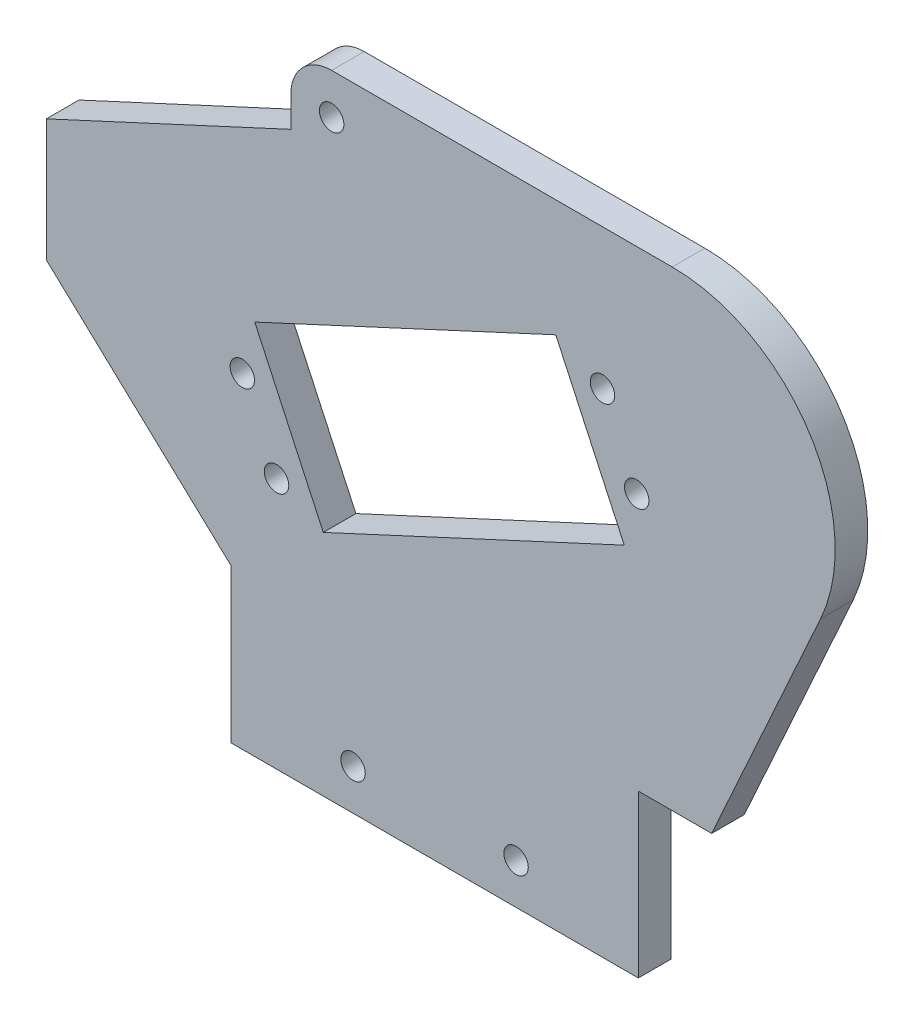
ISO-10303-21;
HEADER;
FILE_DESCRIPTION(('STEP AP214'),'2;1');
FILE_NAME('part.step','',(''),(''),'','','');
FILE_SCHEMA(('AUTOMOTIVE_DESIGN { 1 0 10303 214 1 1 1 1 }'));
ENDSEC;
DATA;
#1=APPLICATION_CONTEXT('core data for automotive mechanical design processes');
#2=APPLICATION_PROTOCOL_DEFINITION('international standard','automotive_design',2000,#1);
#3=PRODUCT_CONTEXT('',#1,'mechanical');
#4=PRODUCT('Part','Part','',(#3));
#5=PRODUCT_RELATED_PRODUCT_CATEGORY('part','',(#4));
#6=PRODUCT_DEFINITION_FORMATION('','',#4);
#7=PRODUCT_DEFINITION_CONTEXT('part definition',#1,'design');
#8=PRODUCT_DEFINITION('design','',#6,#7);
#9=PRODUCT_DEFINITION_SHAPE('','',#8);
#10=(LENGTH_UNIT() NAMED_UNIT(*) SI_UNIT(.MILLI.,.METRE.));
#11=(NAMED_UNIT(*) PLANE_ANGLE_UNIT() SI_UNIT($,.RADIAN.));
#12=(NAMED_UNIT(*) SI_UNIT($,.STERADIAN.) SOLID_ANGLE_UNIT());
#13=UNCERTAINTY_MEASURE_WITH_UNIT(LENGTH_MEASURE(1.E-05),#10,'distance_accuracy_value','');
#14=(GEOMETRIC_REPRESENTATION_CONTEXT(3) GLOBAL_UNCERTAINTY_ASSIGNED_CONTEXT((#13)) GLOBAL_UNIT_ASSIGNED_CONTEXT((#10,
#11,#12)) REPRESENTATION_CONTEXT('',''));
#15=CARTESIAN_POINT('',(0.,0.,0.));
#16=DIRECTION('',(0.,0.,1.));
#17=DIRECTION('',(1.,0.,0.));
#18=AXIS2_PLACEMENT_3D('',#15,#16,#17);
#19=CARTESIAN_POINT('',(0.,-50.,4.));
#20=DIRECTION('',(0.,-1.,0.));
#21=DIRECTION('',(1.,0.,0.));
#22=AXIS2_PLACEMENT_3D('',#19,#20,#21);
#23=PLANE('',#22);
#24=DIRECTION('',(-1.,0.,0.));
#25=VECTOR('',#24,1.);
#26=CARTESIAN_POINT('',(0.,-50.,0.));
#27=LINE('',#26,#25);
#28=CARTESIAN_POINT('',(15.,-50.,0.));
#29=VERTEX_POINT('',#28);
#30=CARTESIAN_POINT('',(-35.,-50.,0.));
#31=VERTEX_POINT('',#30);
#32=EDGE_CURVE('E171',#29,#31,#27,.T.);
#33=ORIENTED_EDGE('',*,*,#32,.F.);
#34=DIRECTION('',(0.,0.,-1.));
#35=VECTOR('',#34,1.);
#36=CARTESIAN_POINT('',(15.,-50.,4.));
#37=LINE('',#36,#35);
#38=CARTESIAN_POINT('',(15.,-50.,4.));
#39=VERTEX_POINT('',#38);
#40=EDGE_CURVE('E11',#39,#29,#37,.T.);
#41=ORIENTED_EDGE('',*,*,#40,.F.);
#42=DIRECTION('',(-1.,0.,0.));
#43=VECTOR('',#42,1.);
#44=CARTESIAN_POINT('',(0.,-50.,4.));
#45=LINE('',#44,#43);
#46=CARTESIAN_POINT('',(-35.,-50.,4.));
#47=VERTEX_POINT('',#46);
#48=EDGE_CURVE('E208',#39,#47,#45,.T.);
#49=ORIENTED_EDGE('',*,*,#48,.T.);
#50=DIRECTION('',(0.,0.,-1.));
#51=VECTOR('',#50,1.);
#52=CARTESIAN_POINT('',(-35.,-50.,4.));
#53=LINE('',#52,#51);
#54=EDGE_CURVE('E209',#47,#31,#53,.T.);
#55=ORIENTED_EDGE('',*,*,#54,.T.);
#56=EDGE_LOOP('',(#33,#41,#49,#55));
#57=FACE_BOUND('',#56,.T.);
#58=ADVANCED_FACE('F36',(#57),#23,.T.);
#59=CARTESIAN_POINT('',(31.2418684292143,-14.1568600723833,4.));
#60=DIRECTION('',(-0.910848988545081,0.412739772818665,0.));
#61=DIRECTION('',(-0.412739772818665,-0.910848988545081,0.));
#62=AXIS2_PLACEMENT_3D('',#59,#60,#61);
#63=PLANE('',#62);
#64=DIRECTION('',(0.412739772818665,0.910848988545081,0.));
#65=VECTOR('',#64,1.);
#66=CARTESIAN_POINT('',(31.2418684292143,-14.1568600723833,4.));
#67=LINE('',#66,#65);
#68=CARTESIAN_POINT('',(24.,-30.1384760162008,4.));
#69=VERTEX_POINT('',#68);
#70=CARTESIAN_POINT('',(37.3725830020305,-0.627378458403735,4.));
#71=VERTEX_POINT('',#70);
#72=EDGE_CURVE('E162',#69,#71,#67,.T.);
#73=ORIENTED_EDGE('',*,*,#72,.F.);
#74=DIRECTION('',(0.,0.,-1.));
#75=VECTOR('',#74,1.);
#76=CARTESIAN_POINT('',(24.,-30.1384760162008,10.));
#77=LINE('',#76,#75);
#78=CARTESIAN_POINT('',(24.,-30.1384760162008,0.));
#79=VERTEX_POINT('',#78);
#80=EDGE_CURVE('E150',#69,#79,#77,.T.);
#81=ORIENTED_EDGE('',*,*,#80,.T.);
#82=DIRECTION('',(0.412739772818665,0.910848988545081,0.));
#83=VECTOR('',#82,1.);
#84=CARTESIAN_POINT('',(31.2418684292143,-14.1568600723833,0.));
#85=LINE('',#84,#83);
#86=CARTESIAN_POINT('',(37.3725830020305,-0.627378458403735,0.));
#87=VERTEX_POINT('',#86);
#88=EDGE_CURVE('E160',#79,#87,#85,.T.);
#89=ORIENTED_EDGE('',*,*,#88,.T.);
#90=DIRECTION('',(0.,0.,-1.));
#91=VECTOR('',#90,1.);
#92=CARTESIAN_POINT('',(37.3725830020305,-0.627378458403735,4.));
#93=LINE('',#92,#91);
#94=EDGE_CURVE('E43',#71,#87,#93,.T.);
#95=ORIENTED_EDGE('',*,*,#94,.F.);
#96=EDGE_LOOP('',(#73,#81,#89,#95));
#97=FACE_BOUND('',#96,.T.);
#98=ADVANCED_FACE('F158',(#97),#63,.F.);
#99=CARTESIAN_POINT('',(19.1556032311289,7.62741699796956,4.));
#100=DIRECTION('',(0.,0.,-1.));
#101=DIRECTION('',(-1.,0.,0.));
#102=AXIS2_PLACEMENT_3D('',#99,#100,#101);
#103=CYLINDRICAL_SURFACE('',#102,20.);
#104=CARTESIAN_POINT('',(19.1556032311289,7.62741699796956,0.));
#105=DIRECTION('',(0.,0.,1.));
#106=DIRECTION('',(1.,0.,0.));
#107=AXIS2_PLACEMENT_3D('',#104,#105,#106);
#108=CIRCLE('',#107,20.);
#109=CARTESIAN_POINT('',(19.1556032311289,27.6274169979696,0.));
#110=VERTEX_POINT('',#109);
#111=EDGE_CURVE('E170',#110,#87,#108,.F.);
#112=ORIENTED_EDGE('',*,*,#111,.F.);
#113=DIRECTION('',(0.,0.,-1.));
#114=VECTOR('',#113,1.);
#115=CARTESIAN_POINT('',(19.1556032311289,27.6274169979696,4.));
#116=LINE('',#115,#114);
#117=CARTESIAN_POINT('',(19.1556032311289,27.6274169979696,4.));
#118=VERTEX_POINT('',#117);
#119=EDGE_CURVE('E224',#118,#110,#116,.T.);
#120=ORIENTED_EDGE('',*,*,#119,.F.);
#121=CARTESIAN_POINT('',(19.1556032311289,7.62741699796956,4.));
#122=DIRECTION('',(0.,0.,1.));
#123=DIRECTION('',(1.,0.,0.));
#124=AXIS2_PLACEMENT_3D('',#121,#122,#123);
#125=CIRCLE('',#124,20.);
#126=EDGE_CURVE('E229',#118,#71,#125,.F.);
#127=ORIENTED_EDGE('',*,*,#126,.T.);
#128=ORIENTED_EDGE('',*,*,#94,.T.);
#129=EDGE_LOOP('',(#112,#120,#127,#128));
#130=FACE_BOUND('',#129,.T.);
#131=ADVANCED_FACE('F227',(#130),#103,.T.);
#132=CARTESIAN_POINT('',(0.,27.6274169979696,4.));
#133=DIRECTION('',(0.,1.,0.));
#134=DIRECTION('',(-1.,0.,0.));
#135=AXIS2_PLACEMENT_3D('',#132,#133,#134);
#136=PLANE('',#135);
#137=DIRECTION('',(1.,0.,0.));
#138=VECTOR('',#137,1.);
#139=CARTESIAN_POINT('',(0.,27.6274169979696,0.));
#140=LINE('',#139,#138);
#141=CARTESIAN_POINT('',(-22.6274169979695,27.6274169979696,0.));
#142=VERTEX_POINT('',#141);
#143=EDGE_CURVE('E173',#142,#110,#140,.T.);
#144=ORIENTED_EDGE('',*,*,#143,.F.);
#145=DIRECTION('',(0.,0.,-1.));
#146=VECTOR('',#145,1.);
#147=CARTESIAN_POINT('',(-22.6274169979695,27.6274169979696,4.));
#148=LINE('',#147,#146);
#149=CARTESIAN_POINT('',(-22.6274169979695,27.6274169979696,4.));
#150=VERTEX_POINT('',#149);
#151=EDGE_CURVE('E222',#150,#142,#148,.T.);
#152=ORIENTED_EDGE('',*,*,#151,.F.);
#153=DIRECTION('',(1.,0.,0.));
#154=VECTOR('',#153,1.);
#155=CARTESIAN_POINT('',(0.,27.6274169979696,4.));
#156=LINE('',#155,#154);
#157=EDGE_CURVE('E233',#150,#118,#156,.T.);
#158=ORIENTED_EDGE('',*,*,#157,.T.);
#159=ORIENTED_EDGE('',*,*,#119,.T.);
#160=EDGE_LOOP('',(#144,#152,#158,#159));
#161=FACE_BOUND('',#160,.T.);
#162=ADVANCED_FACE('F317',(#161),#136,.T.);
#163=CARTESIAN_POINT('',(-22.6274169979695,22.6274169979696,4.));
#164=DIRECTION('',(0.,0.,-1.));
#165=DIRECTION('',(-1.,0.,0.));
#166=AXIS2_PLACEMENT_3D('',#163,#164,#165);
#167=CYLINDRICAL_SURFACE('',#166,5.);
#168=CARTESIAN_POINT('',(-22.6274169979695,22.6274169979696,0.));
#169=DIRECTION('',(0.,0.,1.));
#170=DIRECTION('',(1.,0.,0.));
#171=AXIS2_PLACEMENT_3D('',#168,#169,#170);
#172=CIRCLE('',#171,5.);
#173=CARTESIAN_POINT('',(-27.6274169979695,22.6274169979696,0.));
#174=VERTEX_POINT('',#173);
#175=EDGE_CURVE('E181',#174,#142,#172,.F.);
#176=ORIENTED_EDGE('',*,*,#175,.F.);
#177=DIRECTION('',(0.,0.,-1.));
#178=VECTOR('',#177,1.);
#179=CARTESIAN_POINT('',(-27.6274169979695,22.6274169979696,4.));
#180=LINE('',#179,#178);
#181=CARTESIAN_POINT('',(-27.6274169979695,22.6274169979696,4.));
#182=VERTEX_POINT('',#181);
#183=EDGE_CURVE('E220',#182,#174,#180,.T.);
#184=ORIENTED_EDGE('',*,*,#183,.F.);
#185=CARTESIAN_POINT('',(-22.6274169979695,22.6274169979696,4.));
#186=DIRECTION('',(0.,0.,1.));
#187=DIRECTION('',(1.,0.,0.));
#188=AXIS2_PLACEMENT_3D('',#185,#186,#187);
#189=CIRCLE('',#188,5.);
#190=EDGE_CURVE('E235',#182,#150,#189,.F.);
#191=ORIENTED_EDGE('',*,*,#190,.T.);
#192=ORIENTED_EDGE('',*,*,#151,.T.);
#193=EDGE_LOOP('',(#176,#184,#191,#192));
#194=FACE_BOUND('',#193,.T.);
#195=ADVANCED_FACE('F314',(#194),#167,.T.);
#196=CARTESIAN_POINT('',(-27.6274169979695,0.,4.));
#197=DIRECTION('',(-1.,0.,0.));
#198=DIRECTION('',(0.,0.,1.));
#199=AXIS2_PLACEMENT_3D('',#196,#197,#198);
#200=PLANE('',#199);
#201=DIRECTION('',(0.,1.,0.));
#202=VECTOR('',#201,1.);
#203=CARTESIAN_POINT('',(-27.6274169979695,0.,0.));
#204=LINE('',#203,#202);
#205=CARTESIAN_POINT('',(-27.6274169979695,18.8599043076142,0.));
#206=VERTEX_POINT('',#205);
#207=EDGE_CURVE('E184',#206,#174,#204,.T.);
#208=ORIENTED_EDGE('',*,*,#207,.F.);
#209=DIRECTION('',(0.,0.,-1.));
#210=VECTOR('',#209,1.);
#211=CARTESIAN_POINT('',(-27.6274169979695,18.8599043076142,4.));
#212=LINE('',#211,#210);
#213=CARTESIAN_POINT('',(-27.6274169979695,18.8599043076142,4.));
#214=VERTEX_POINT('',#213);
#215=EDGE_CURVE('E218',#214,#206,#212,.T.);
#216=ORIENTED_EDGE('',*,*,#215,.F.);
#217=DIRECTION('',(0.,1.,0.));
#218=VECTOR('',#217,1.);
#219=CARTESIAN_POINT('',(-27.6274169979695,0.,4.));
#220=LINE('',#219,#218);
#221=EDGE_CURVE('E242',#214,#182,#220,.T.);
#222=ORIENTED_EDGE('',*,*,#221,.T.);
#223=ORIENTED_EDGE('',*,*,#183,.T.);
#224=EDGE_LOOP('',(#208,#216,#222,#223));
#225=FACE_BOUND('',#224,.T.);
#226=ADVANCED_FACE('F310',(#225),#200,.T.);
#227=CARTESIAN_POINT('',(-12.0602624641426,26.0632911788168,4.));
#228=DIRECTION('',(-0.419949330471577,0.907547552383055,0.));
#229=DIRECTION('',(-0.907547552383055,-0.419949330471577,0.));
#230=AXIS2_PLACEMENT_3D('',#227,#228,#229);
#231=PLANE('',#230);
#232=DIRECTION('',(0.907547552383055,0.419949330471577,0.));
#233=VECTOR('',#232,1.);
#234=CARTESIAN_POINT('',(-12.0602624641426,26.0632911788168,0.));
#235=LINE('',#234,#233);
#236=CARTESIAN_POINT('',(-57.6274169979695,4.97800921455162,0.));
#237=VERTEX_POINT('',#236);
#238=EDGE_CURVE('E187',#237,#206,#235,.T.);
#239=ORIENTED_EDGE('',*,*,#238,.F.);
#240=DIRECTION('',(0.,0.,-1.));
#241=VECTOR('',#240,1.);
#242=CARTESIAN_POINT('',(-57.6274169979695,4.97800921455162,4.));
#243=LINE('',#242,#241);
#244=CARTESIAN_POINT('',(-57.6274169979695,4.97800921455162,4.));
#245=VERTEX_POINT('',#244);
#246=EDGE_CURVE('E216',#245,#237,#243,.T.);
#247=ORIENTED_EDGE('',*,*,#246,.F.);
#248=DIRECTION('',(0.907547552383055,0.419949330471577,0.));
#249=VECTOR('',#248,1.);
#250=CARTESIAN_POINT('',(-12.0602624641426,26.0632911788168,4.));
#251=LINE('',#250,#249);
#252=EDGE_CURVE('E245',#245,#214,#251,.T.);
#253=ORIENTED_EDGE('',*,*,#252,.T.);
#254=ORIENTED_EDGE('',*,*,#215,.T.);
#255=EDGE_LOOP('',(#239,#247,#253,#254));
#256=FACE_BOUND('',#255,.T.);
#257=ADVANCED_FACE('F306',(#256),#231,.T.);
#258=CARTESIAN_POINT('',(-57.6274169979695,0.,4.));
#259=DIRECTION('',(-1.,0.,0.));
#260=DIRECTION('',(0.,0.,1.));
#261=AXIS2_PLACEMENT_3D('',#258,#259,#260);
#262=PLANE('',#261);
#263=DIRECTION('',(0.,1.,0.));
#264=VECTOR('',#263,1.);
#265=CARTESIAN_POINT('',(-57.6274169979695,0.,0.));
#266=LINE('',#265,#264);
#267=CARTESIAN_POINT('',(-57.6274169979695,-10.0219907854484,0.));
#268=VERTEX_POINT('',#267);
#269=EDGE_CURVE('E190',#268,#237,#266,.T.);
#270=ORIENTED_EDGE('',*,*,#269,.F.);
#271=DIRECTION('',(0.,0.,-1.));
#272=VECTOR('',#271,1.);
#273=CARTESIAN_POINT('',(-57.6274169979695,-10.0219907854484,4.));
#274=LINE('',#273,#272);
#275=CARTESIAN_POINT('',(-57.6274169979695,-10.0219907854484,4.));
#276=VERTEX_POINT('',#275);
#277=EDGE_CURVE('E214',#276,#268,#274,.T.);
#278=ORIENTED_EDGE('',*,*,#277,.F.);
#279=DIRECTION('',(0.,1.,0.));
#280=VECTOR('',#279,1.);
#281=CARTESIAN_POINT('',(-57.6274169979695,0.,4.));
#282=LINE('',#281,#280);
#283=EDGE_CURVE('E248',#276,#245,#282,.T.);
#284=ORIENTED_EDGE('',*,*,#283,.T.);
#285=ORIENTED_EDGE('',*,*,#246,.T.);
#286=EDGE_LOOP('',(#270,#278,#284,#285));
#287=FACE_BOUND('',#286,.T.);
#288=ADVANCED_FACE('F302',(#287),#262,.T.);
#289=CARTESIAN_POINT('',(-31.826885426635,-34.1015546361118,4.));
#290=DIRECTION('',(-0.682304132096237,-0.73106844503398,0.));
#291=DIRECTION('',(0.73106844503398,-0.682304132096237,0.));
#292=AXIS2_PLACEMENT_3D('',#289,#290,#291);
#293=PLANE('',#292);
#294=DIRECTION('',(-0.73106844503398,0.682304132096237,0.));
#295=VECTOR('',#294,1.);
#296=CARTESIAN_POINT('',(-31.826885426635,-34.1015546361118,0.));
#297=LINE('',#296,#295);
#298=CARTESIAN_POINT('',(-35.,-31.1400956923858,0.));
#299=VERTEX_POINT('',#298);
#300=EDGE_CURVE('E193',#299,#268,#297,.T.);
#301=ORIENTED_EDGE('',*,*,#300,.F.);
#302=DIRECTION('',(0.,0.,-1.));
#303=VECTOR('',#302,1.);
#304=CARTESIAN_POINT('',(-35.,-31.1400956923858,4.));
#305=LINE('',#304,#303);
#306=CARTESIAN_POINT('',(-35.,-31.1400956923858,4.));
#307=VERTEX_POINT('',#306);
#308=EDGE_CURVE('E211',#307,#299,#305,.T.);
#309=ORIENTED_EDGE('',*,*,#308,.F.);
#310=DIRECTION('',(-0.73106844503398,0.682304132096237,0.));
#311=VECTOR('',#310,1.);
#312=CARTESIAN_POINT('',(-31.826885426635,-34.1015546361118,4.));
#313=LINE('',#312,#311);
#314=EDGE_CURVE('E251',#307,#276,#313,.T.);
#315=ORIENTED_EDGE('',*,*,#314,.T.);
#316=ORIENTED_EDGE('',*,*,#277,.T.);
#317=EDGE_LOOP('',(#301,#309,#315,#316));
#318=FACE_BOUND('',#317,.T.);
#319=ADVANCED_FACE('F298',(#318),#293,.T.);
#320=CARTESIAN_POINT('',(-22.6274169979695,22.6274169979696,4.));
#321=DIRECTION('',(0.,0.,-1.));
#322=DIRECTION('',(-1.,0.,0.));
#323=AXIS2_PLACEMENT_3D('',#320,#321,#322);
#324=CYLINDRICAL_SURFACE('',#323,1.5);
#325=CARTESIAN_POINT('',(-22.6274169979695,22.6274169979696,4.));
#326=DIRECTION('',(0.,0.,1.));
#327=DIRECTION('',(1.,0.,0.));
#328=AXIS2_PLACEMENT_3D('',#325,#326,#327);
#329=CIRCLE('',#328,1.5);
#330=CARTESIAN_POINT('',(-21.1274169979695,22.6274169979696,4.));
#331=VERTEX_POINT('',#330);
#332=EDGE_CURVE('E260',#331,#331,#329,.T.);
#333=ORIENTED_EDGE('',*,*,#332,.T.);
#334=EDGE_LOOP('',(#333));
#335=FACE_BOUND('',#334,.T.);
#336=CARTESIAN_POINT('',(-22.6274169979695,22.6274169979696,0.));
#337=DIRECTION('',(0.,0.,1.));
#338=DIRECTION('',(1.,0.,0.));
#339=AXIS2_PLACEMENT_3D('',#336,#337,#338);
#340=CIRCLE('',#339,1.5);
#341=CARTESIAN_POINT('',(-21.1274169979695,22.6274169979696,0.));
#342=VERTEX_POINT('',#341);
#343=EDGE_CURVE('E202',#342,#342,#340,.T.);
#344=ORIENTED_EDGE('',*,*,#343,.F.);
#345=EDGE_LOOP('',(#344));
#346=FACE_BOUND('',#345,.T.);
#347=ADVANCED_FACE('F498',(#335,#346),#324,.F.);
#348=CARTESIAN_POINT('',(0.,-45.,4.));
#349=DIRECTION('',(0.,0.,-1.));
#350=DIRECTION('',(-1.,0.,0.));
#351=AXIS2_PLACEMENT_3D('',#348,#349,#350);
#352=CYLINDRICAL_SURFACE('',#351,1.5);
#353=CARTESIAN_POINT('',(0.,-45.,4.));
#354=DIRECTION('',(0.,0.,1.));
#355=DIRECTION('',(1.,0.,0.));
#356=AXIS2_PLACEMENT_3D('',#353,#354,#355);
#357=CIRCLE('',#356,1.5);
#358=CARTESIAN_POINT('',(1.50000000000001,-45.,4.));
#359=VERTEX_POINT('',#358);
#360=EDGE_CURVE('E257',#359,#359,#357,.T.);
#361=ORIENTED_EDGE('',*,*,#360,.T.);
#362=EDGE_LOOP('',(#361));
#363=FACE_BOUND('',#362,.T.);
#364=CARTESIAN_POINT('',(0.,-45.,0.));
#365=DIRECTION('',(0.,0.,1.));
#366=DIRECTION('',(1.,0.,0.));
#367=AXIS2_PLACEMENT_3D('',#364,#365,#366);
#368=CIRCLE('',#367,1.5);
#369=CARTESIAN_POINT('',(1.50000000000001,-45.,0.));
#370=VERTEX_POINT('',#369);
#371=EDGE_CURVE('E199',#370,#370,#368,.T.);
#372=ORIENTED_EDGE('',*,*,#371,.F.);
#373=EDGE_LOOP('',(#372));
#374=FACE_BOUND('',#373,.T.);
#375=ADVANCED_FACE('F490',(#363,#374),#352,.F.);
#376=CARTESIAN_POINT('',(-35.,0.,4.));
#377=DIRECTION('',(-1.,0.,0.));
#378=DIRECTION('',(0.,0.,1.));
#379=AXIS2_PLACEMENT_3D('',#376,#377,#378);
#380=PLANE('',#379);
#381=DIRECTION('',(0.,1.,0.));
#382=VECTOR('',#381,1.);
#383=CARTESIAN_POINT('',(-35.,0.,0.));
#384=LINE('',#383,#382);
#385=EDGE_CURVE('E196',#31,#299,#384,.T.);
#386=ORIENTED_EDGE('',*,*,#385,.F.);
#387=ORIENTED_EDGE('',*,*,#54,.F.);
#388=DIRECTION('',(0.,1.,0.));
#389=VECTOR('',#388,1.);
#390=CARTESIAN_POINT('',(-35.,0.,4.));
#391=LINE('',#390,#389);
#392=EDGE_CURVE('E254',#47,#307,#391,.T.);
#393=ORIENTED_EDGE('',*,*,#392,.T.);
#394=ORIENTED_EDGE('',*,*,#308,.T.);
#395=EDGE_LOOP('',(#386,#387,#393,#394));
#396=FACE_BOUND('',#395,.T.);
#397=ADVANCED_FACE('F278',(#396),#380,.T.);
#398=CARTESIAN_POINT('',(-20.,-45.,4.));
#399=DIRECTION('',(0.,0.,-1.));
#400=DIRECTION('',(-1.,0.,0.));
#401=AXIS2_PLACEMENT_3D('',#398,#399,#400);
#402=CYLINDRICAL_SURFACE('',#401,1.5);
#403=CARTESIAN_POINT('',(-20.,-45.,4.));
#404=DIRECTION('',(0.,0.,1.));
#405=DIRECTION('',(1.,0.,0.));
#406=AXIS2_PLACEMENT_3D('',#403,#404,#405);
#407=CIRCLE('',#406,1.5);
#408=CARTESIAN_POINT('',(-18.5,-45.,4.));
#409=VERTEX_POINT('',#408);
#410=EDGE_CURVE('E212',#409,#409,#407,.T.);
#411=ORIENTED_EDGE('',*,*,#410,.T.);
#412=EDGE_LOOP('',(#411));
#413=FACE_BOUND('',#412,.T.);
#414=CARTESIAN_POINT('',(-20.,-45.,0.));
#415=DIRECTION('',(0.,0.,1.));
#416=DIRECTION('',(1.,0.,0.));
#417=AXIS2_PLACEMENT_3D('',#414,#415,#416);
#418=CIRCLE('',#417,1.5);
#419=CARTESIAN_POINT('',(-18.5,-45.,0.));
#420=VERTEX_POINT('',#419);
#421=EDGE_CURVE('E205',#420,#420,#418,.T.);
#422=ORIENTED_EDGE('',*,*,#421,.F.);
#423=EDGE_LOOP('',(#422));
#424=FACE_BOUND('',#423,.T.);
#425=ADVANCED_FACE('F265',(#413,#424),#402,.F.);
#426=CARTESIAN_POINT('',(0.,0.,4.));
#427=DIRECTION('',(0.,0.,1.));
#428=DIRECTION('',(1.,0.,0.));
#429=AXIS2_PLACEMENT_3D('',#426,#427,#428);
#430=PLANE('',#429);
#431=DIRECTION('',(0.,-1.,0.));
#432=VECTOR('',#431,1.);
#433=CARTESIAN_POINT('',(15.,0.,4.));
#434=LINE('',#433,#432);
#435=CARTESIAN_POINT('',(15.,-30.1384760162008,4.));
#436=VERTEX_POINT('',#435);
#437=EDGE_CURVE('E318',#436,#39,#434,.T.);
#438=ORIENTED_EDGE('',*,*,#437,.F.);
#439=DIRECTION('',(-1.,0.,0.));
#440=VECTOR('',#439,1.);
#441=CARTESIAN_POINT('',(0.,-30.1384760162008,4.));
#442=LINE('',#441,#440);
#443=EDGE_CURVE('E163',#69,#436,#442,.T.);
#444=ORIENTED_EDGE('',*,*,#443,.F.);
#445=ORIENTED_EDGE('',*,*,#72,.T.);
#446=ORIENTED_EDGE('',*,*,#126,.F.);
#447=ORIENTED_EDGE('',*,*,#157,.F.);
#448=ORIENTED_EDGE('',*,*,#190,.F.);
#449=ORIENTED_EDGE('',*,*,#221,.F.);
#450=ORIENTED_EDGE('',*,*,#252,.F.);
#451=ORIENTED_EDGE('',*,*,#283,.F.);
#452=ORIENTED_EDGE('',*,*,#314,.F.);
#453=ORIENTED_EDGE('',*,*,#392,.F.);
#454=ORIENTED_EDGE('',*,*,#48,.F.);
#455=EDGE_LOOP('',(#438,#444,#445,#446,#447,#448,#449,#450,#451,#452,#453,#454));
#456=FACE_BOUND('',#455,.T.);
#457=CARTESIAN_POINT('',(10.6013869918596,10.4216406505323,4.));
#458=DIRECTION('',(0.,0.,1.));
#459=DIRECTION('',(1.,0.,0.));
#460=AXIS2_PLACEMENT_3D('',#457,#458,#459);
#461=CIRCLE('',#460,1.5);
#462=CARTESIAN_POINT('',(12.1013869918596,10.4216406505323,4.));
#463=VERTEX_POINT('',#462);
#464=EDGE_CURVE('E364',#463,#463,#461,.T.);
#465=ORIENTED_EDGE('',*,*,#464,.F.);
#466=EDGE_LOOP('',(#465));
#467=FACE_BOUND('',#466,.T.);
#468=CARTESIAN_POINT('',(14.804827451052,1.34799263520661,4.));
#469=DIRECTION('',(0.,0.,1.));
#470=DIRECTION('',(1.,0.,0.));
#471=AXIS2_PLACEMENT_3D('',#468,#469,#470);
#472=CIRCLE('',#471,1.5);
#473=CARTESIAN_POINT('',(16.304827451052,1.34799263520661,4.));
#474=VERTEX_POINT('',#473);
#475=EDGE_CURVE('E358',#474,#474,#472,.T.);
#476=ORIENTED_EDGE('',*,*,#475,.F.);
#477=EDGE_LOOP('',(#476));
#478=FACE_BOUND('',#477,.T.);
#479=CARTESIAN_POINT('',(-29.3838383835841,-19.1227624010607,4.));
#480=DIRECTION('',(0.,0.,1.));
#481=DIRECTION('',(1.,0.,0.));
#482=AXIS2_PLACEMENT_3D('',#479,#480,#481);
#483=CIRCLE('',#482,1.5);
#484=CARTESIAN_POINT('',(-27.8838383835841,-19.1227624010607,4.));
#485=VERTEX_POINT('',#484);
#486=EDGE_CURVE('E352',#485,#485,#483,.T.);
#487=ORIENTED_EDGE('',*,*,#486,.F.);
#488=EDGE_LOOP('',(#487));
#489=FACE_BOUND('',#488,.T.);
#490=CARTESIAN_POINT('',(-33.5872788427765,-10.049114385735,4.));
#491=DIRECTION('',(0.,0.,1.));
#492=DIRECTION('',(1.,0.,0.));
#493=AXIS2_PLACEMENT_3D('',#490,#491,#492);
#494=CIRCLE('',#493,1.5);
#495=CARTESIAN_POINT('',(-32.0872788427765,-10.049114385735,4.));
#496=VERTEX_POINT('',#495);
#497=EDGE_CURVE('E349',#496,#496,#494,.T.);
#498=ORIENTED_EDGE('',*,*,#497,.F.);
#499=EDGE_LOOP('',(#498));
#500=FACE_BOUND('',#499,.T.);
#501=DIRECTION('',(0.907364801532571,0.420344045919243,0.));
#502=VECTOR('',#501,1.);
#503=CARTESIAN_POINT('',(4.20344045919242,-9.07364801532569,4.));
#504=LINE('',#503,#502);
#505=CARTESIAN_POINT('',(-23.6526589478576,-21.9782102250465,4.));
#506=VERTEX_POINT('',#505);
#507=CARTESIAN_POINT('',(13.277088474518,-4.87020755613331,4.));
#508=VERTEX_POINT('',#507);
#509=EDGE_CURVE('E57',#506,#508,#504,.T.);
#510=ORIENTED_EDGE('',*,*,#509,.F.);
#511=DIRECTION('',(-0.420344045919246,0.907364801532569,0.));
#512=VECTOR('',#511,1.);
#513=CARTESIAN_POINT('',(-27.85609940705,-12.9045622097209,4.));
#514=LINE('',#513,#512);
#515=CARTESIAN_POINT('',(-32.0595398662425,-3.83091419439522,4.));
#516=VERTEX_POINT('',#515);
#517=EDGE_CURVE('E328',#506,#516,#514,.T.);
#518=ORIENTED_EDGE('',*,*,#517,.T.);
#519=DIRECTION('',(0.907364801532569,0.420344045919246,0.));
#520=VECTOR('',#519,1.);
#521=CARTESIAN_POINT('',(-4.20344045919245,9.07364801532569,4.));
#522=LINE('',#521,#520);
#523=CARTESIAN_POINT('',(4.87020755613311,13.2770884745181,4.));
#524=VERTEX_POINT('',#523);
#525=EDGE_CURVE('E332',#516,#524,#522,.T.);
#526=ORIENTED_EDGE('',*,*,#525,.T.);
#527=DIRECTION('',(-0.420344045919246,0.907364801532569,0.));
#528=VECTOR('',#527,1.);
#529=CARTESIAN_POINT('',(9.07364801532556,4.20344045919239,4.));
#530=LINE('',#529,#528);
#531=EDGE_CURVE('E335',#508,#524,#530,.T.);
#532=ORIENTED_EDGE('',*,*,#531,.F.);
#533=EDGE_LOOP('',(#510,#518,#526,#532));
#534=FACE_BOUND('',#533,.T.);
#535=ORIENTED_EDGE('',*,*,#360,.F.);
#536=EDGE_LOOP('',(#535));
#537=FACE_BOUND('',#536,.T.);
#538=ORIENTED_EDGE('',*,*,#332,.F.);
#539=EDGE_LOOP('',(#538));
#540=FACE_BOUND('',#539,.T.);
#541=ORIENTED_EDGE('',*,*,#410,.F.);
#542=EDGE_LOOP('',(#541));
#543=FACE_BOUND('',#542,.T.);
#544=ADVANCED_FACE('F268',(#456,#467,#478,#489,#500,#534,#537,#540,#543),#430,.T.);
#545=CARTESIAN_POINT('',(0.,0.,0.));
#546=DIRECTION('',(0.,0.,1.));
#547=DIRECTION('',(1.,0.,0.));
#548=AXIS2_PLACEMENT_3D('',#545,#546,#547);
#549=PLANE('',#548);
#550=CARTESIAN_POINT('',(10.6013869918596,10.4216406505323,0.));
#551=DIRECTION('',(0.,0.,1.));
#552=DIRECTION('',(1.,0.,0.));
#553=AXIS2_PLACEMENT_3D('',#550,#551,#552);
#554=CIRCLE('',#553,1.5);
#555=CARTESIAN_POINT('',(12.1013869918596,10.4216406505323,0.));
#556=VERTEX_POINT('',#555);
#557=EDGE_CURVE('E367',#556,#556,#554,.T.);
#558=ORIENTED_EDGE('',*,*,#557,.T.);
#559=EDGE_LOOP('',(#558));
#560=FACE_BOUND('',#559,.T.);
#561=CARTESIAN_POINT('',(14.804827451052,1.34799263520661,0.));
#562=DIRECTION('',(0.,0.,1.));
#563=DIRECTION('',(1.,0.,0.));
#564=AXIS2_PLACEMENT_3D('',#561,#562,#563);
#565=CIRCLE('',#564,1.5);
#566=CARTESIAN_POINT('',(16.304827451052,1.34799263520661,0.));
#567=VERTEX_POINT('',#566);
#568=EDGE_CURVE('E361',#567,#567,#565,.T.);
#569=ORIENTED_EDGE('',*,*,#568,.T.);
#570=EDGE_LOOP('',(#569));
#571=FACE_BOUND('',#570,.T.);
#572=CARTESIAN_POINT('',(-29.3838383835841,-19.1227624010607,0.));
#573=DIRECTION('',(0.,0.,1.));
#574=DIRECTION('',(1.,0.,0.));
#575=AXIS2_PLACEMENT_3D('',#572,#573,#574);
#576=CIRCLE('',#575,1.5);
#577=CARTESIAN_POINT('',(-27.8838383835841,-19.1227624010607,0.));
#578=VERTEX_POINT('',#577);
#579=EDGE_CURVE('E355',#578,#578,#576,.T.);
#580=ORIENTED_EDGE('',*,*,#579,.T.);
#581=EDGE_LOOP('',(#580));
#582=FACE_BOUND('',#581,.T.);
#583=CARTESIAN_POINT('',(-33.5872788427765,-10.049114385735,0.));
#584=DIRECTION('',(0.,0.,1.));
#585=DIRECTION('',(1.,0.,0.));
#586=AXIS2_PLACEMENT_3D('',#583,#584,#585);
#587=CIRCLE('',#586,1.5);
#588=CARTESIAN_POINT('',(-32.0872788427765,-10.049114385735,0.));
#589=VERTEX_POINT('',#588);
#590=EDGE_CURVE('E339',#589,#589,#587,.T.);
#591=ORIENTED_EDGE('',*,*,#590,.T.);
#592=EDGE_LOOP('',(#591));
#593=FACE_BOUND('',#592,.T.);
#594=DIRECTION('',(-0.420344045919246,0.907364801532569,0.));
#595=VECTOR('',#594,1.);
#596=CARTESIAN_POINT('',(-27.85609940705,-12.9045622097209,0.));
#597=LINE('',#596,#595);
#598=CARTESIAN_POINT('',(-23.6526589478576,-21.9782102250465,0.));
#599=VERTEX_POINT('',#598);
#600=CARTESIAN_POINT('',(-32.0595398662425,-3.83091419439522,0.));
#601=VERTEX_POINT('',#600);
#602=EDGE_CURVE('E323',#599,#601,#597,.T.);
#603=ORIENTED_EDGE('',*,*,#602,.F.);
#604=DIRECTION('',(0.907364801532571,0.420344045919243,0.));
#605=VECTOR('',#604,1.);
#606=CARTESIAN_POINT('',(4.20344045919242,-9.07364801532569,0.));
#607=LINE('',#606,#605);
#608=CARTESIAN_POINT('',(13.277088474518,-4.87020755613331,0.));
#609=VERTEX_POINT('',#608);
#610=EDGE_CURVE('E331',#599,#609,#607,.T.);
#611=ORIENTED_EDGE('',*,*,#610,.T.);
#612=DIRECTION('',(-0.420344045919246,0.907364801532569,0.));
#613=VECTOR('',#612,1.);
#614=CARTESIAN_POINT('',(9.07364801532556,4.20344045919239,0.));
#615=LINE('',#614,#613);
#616=CARTESIAN_POINT('',(4.87020755613311,13.2770884745181,0.));
#617=VERTEX_POINT('',#616);
#618=EDGE_CURVE('E344',#609,#617,#615,.T.);
#619=ORIENTED_EDGE('',*,*,#618,.T.);
#620=DIRECTION('',(0.907364801532569,0.420344045919246,0.));
#621=VECTOR('',#620,1.);
#622=CARTESIAN_POINT('',(-4.20344045919245,9.07364801532569,0.));
#623=LINE('',#622,#621);
#624=EDGE_CURVE('E341',#601,#617,#623,.T.);
#625=ORIENTED_EDGE('',*,*,#624,.F.);
#626=EDGE_LOOP('',(#603,#611,#619,#625));
#627=FACE_BOUND('',#626,.T.);
#628=DIRECTION('',(1.,0.,0.));
#629=VECTOR('',#628,1.);
#630=CARTESIAN_POINT('',(15.,-30.1384760162008,0.));
#631=LINE('',#630,#629);
#632=CARTESIAN_POINT('',(15.,-30.1384760162008,0.));
#633=VERTEX_POINT('',#632);
#634=EDGE_CURVE('E147',#633,#79,#631,.T.);
#635=ORIENTED_EDGE('',*,*,#634,.F.);
#636=DIRECTION('',(0.,1.,0.));
#637=VECTOR('',#636,1.);
#638=CARTESIAN_POINT('',(15.,-50.,0.));
#639=LINE('',#638,#637);
#640=EDGE_CURVE('E49',#29,#633,#639,.T.);
#641=ORIENTED_EDGE('',*,*,#640,.F.);
#642=ORIENTED_EDGE('',*,*,#32,.T.);
#643=ORIENTED_EDGE('',*,*,#385,.T.);
#644=ORIENTED_EDGE('',*,*,#300,.T.);
#645=ORIENTED_EDGE('',*,*,#269,.T.);
#646=ORIENTED_EDGE('',*,*,#238,.T.);
#647=ORIENTED_EDGE('',*,*,#207,.T.);
#648=ORIENTED_EDGE('',*,*,#175,.T.);
#649=ORIENTED_EDGE('',*,*,#143,.T.);
#650=ORIENTED_EDGE('',*,*,#111,.T.);
#651=ORIENTED_EDGE('',*,*,#88,.F.);
#652=EDGE_LOOP('',(#635,#641,#642,#643,#644,#645,#646,#647,#648,#649,#650,#651));
#653=FACE_BOUND('',#652,.T.);
#654=ORIENTED_EDGE('',*,*,#371,.T.);
#655=EDGE_LOOP('',(#654));
#656=FACE_BOUND('',#655,.T.);
#657=ORIENTED_EDGE('',*,*,#343,.T.);
#658=EDGE_LOOP('',(#657));
#659=FACE_BOUND('',#658,.T.);
#660=ORIENTED_EDGE('',*,*,#421,.T.);
#661=EDGE_LOOP('',(#660));
#662=FACE_BOUND('',#661,.T.);
#663=ADVANCED_FACE('F166',(#560,#571,#582,#593,#627,#653,#656,#659,#662),#549,.F.);
#664=CARTESIAN_POINT('',(4.20344045919242,-9.07364801532569,0.));
#665=DIRECTION('',(0.420344045919243,-0.907364801532571,0.));
#666=DIRECTION('',(0.907364801532571,0.420344045919243,0.));
#667=AXIS2_PLACEMENT_3D('',#664,#665,#666);
#668=PLANE('',#667);
#669=ORIENTED_EDGE('',*,*,#509,.T.);
#670=DIRECTION('',(0.,0.,1.));
#671=VECTOR('',#670,1.);
#672=CARTESIAN_POINT('',(13.277088474518,-4.87020755613331,0.));
#673=LINE('',#672,#671);
#674=EDGE_CURVE('E320',#609,#508,#673,.T.);
#675=ORIENTED_EDGE('',*,*,#674,.F.);
#676=ORIENTED_EDGE('',*,*,#610,.F.);
#677=DIRECTION('',(0.,0.,1.));
#678=VECTOR('',#677,1.);
#679=CARTESIAN_POINT('',(-23.6526589478576,-21.9782102250465,0.));
#680=LINE('',#679,#678);
#681=EDGE_CURVE('E176',#599,#506,#680,.T.);
#682=ORIENTED_EDGE('',*,*,#681,.T.);
#683=EDGE_LOOP('',(#669,#675,#676,#682));
#684=FACE_BOUND('',#683,.T.);
#685=ADVANCED_FACE('F275',(#684),#668,.F.);
#686=CARTESIAN_POINT('',(-27.85609940705,-12.9045622097209,0.));
#687=DIRECTION('',(0.907364801532569,0.420344045919246,0.));
#688=DIRECTION('',(-0.420344045919246,0.907364801532569,0.));
#689=AXIS2_PLACEMENT_3D('',#686,#687,#688);
#690=PLANE('',#689);
#691=ORIENTED_EDGE('',*,*,#517,.F.);
#692=ORIENTED_EDGE('',*,*,#681,.F.);
#693=ORIENTED_EDGE('',*,*,#602,.T.);
#694=DIRECTION('',(0.,0.,1.));
#695=VECTOR('',#694,1.);
#696=CARTESIAN_POINT('',(-32.0595398662425,-3.83091419439522,0.));
#697=LINE('',#696,#695);
#698=EDGE_CURVE('E325',#601,#516,#697,.T.);
#699=ORIENTED_EDGE('',*,*,#698,.T.);
#700=EDGE_LOOP('',(#691,#692,#693,#699));
#701=FACE_BOUND('',#700,.T.);
#702=ADVANCED_FACE('F400',(#701),#690,.T.);
#703=CARTESIAN_POINT('',(-4.20344045919245,9.07364801532569,0.));
#704=DIRECTION('',(0.420344045919246,-0.907364801532569,0.));
#705=DIRECTION('',(0.907364801532569,0.420344045919246,0.));
#706=AXIS2_PLACEMENT_3D('',#703,#704,#705);
#707=PLANE('',#706);
#708=ORIENTED_EDGE('',*,*,#525,.F.);
#709=ORIENTED_EDGE('',*,*,#698,.F.);
#710=ORIENTED_EDGE('',*,*,#624,.T.);
#711=DIRECTION('',(0.,0.,1.));
#712=VECTOR('',#711,1.);
#713=CARTESIAN_POINT('',(4.87020755613311,13.2770884745181,0.));
#714=LINE('',#713,#712);
#715=EDGE_CURVE('E322',#617,#524,#714,.T.);
#716=ORIENTED_EDGE('',*,*,#715,.T.);
#717=EDGE_LOOP('',(#708,#709,#710,#716));
#718=FACE_BOUND('',#717,.T.);
#719=ADVANCED_FACE('F403',(#718),#707,.T.);
#720=CARTESIAN_POINT('',(9.07364801532556,4.20344045919239,0.));
#721=DIRECTION('',(0.907364801532569,0.420344045919246,0.));
#722=DIRECTION('',(-0.420344045919246,0.907364801532569,0.));
#723=AXIS2_PLACEMENT_3D('',#720,#721,#722);
#724=PLANE('',#723);
#725=ORIENTED_EDGE('',*,*,#531,.T.);
#726=ORIENTED_EDGE('',*,*,#715,.F.);
#727=ORIENTED_EDGE('',*,*,#618,.F.);
#728=ORIENTED_EDGE('',*,*,#674,.T.);
#729=EDGE_LOOP('',(#725,#726,#727,#728));
#730=FACE_BOUND('',#729,.T.);
#731=ADVANCED_FACE('F398',(#730),#724,.F.);
#732=CARTESIAN_POINT('',(-33.5872788427765,-10.049114385735,0.));
#733=DIRECTION('',(0.,0.,1.));
#734=DIRECTION('',(1.,0.,0.));
#735=AXIS2_PLACEMENT_3D('',#732,#733,#734);
#736=CYLINDRICAL_SURFACE('',#735,1.5);
#737=ORIENTED_EDGE('',*,*,#590,.F.);
#738=EDGE_LOOP('',(#737));
#739=FACE_BOUND('',#738,.T.);
#740=ORIENTED_EDGE('',*,*,#497,.T.);
#741=EDGE_LOOP('',(#740));
#742=FACE_BOUND('',#741,.T.);
#743=ADVANCED_FACE('F394',(#739,#742),#736,.F.);
#744=CARTESIAN_POINT('',(-29.3838383835841,-19.1227624010607,0.));
#745=DIRECTION('',(0.,0.,1.));
#746=DIRECTION('',(1.,0.,0.));
#747=AXIS2_PLACEMENT_3D('',#744,#745,#746);
#748=CYLINDRICAL_SURFACE('',#747,1.5);
#749=ORIENTED_EDGE('',*,*,#579,.F.);
#750=EDGE_LOOP('',(#749));
#751=FACE_BOUND('',#750,.T.);
#752=ORIENTED_EDGE('',*,*,#486,.T.);
#753=EDGE_LOOP('',(#752));
#754=FACE_BOUND('',#753,.T.);
#755=ADVANCED_FACE('F390',(#751,#754),#748,.F.);
#756=CARTESIAN_POINT('',(14.804827451052,1.34799263520661,0.));
#757=DIRECTION('',(0.,0.,1.));
#758=DIRECTION('',(1.,0.,0.));
#759=AXIS2_PLACEMENT_3D('',#756,#757,#758);
#760=CYLINDRICAL_SURFACE('',#759,1.5);
#761=ORIENTED_EDGE('',*,*,#568,.F.);
#762=EDGE_LOOP('',(#761));
#763=FACE_BOUND('',#762,.T.);
#764=ORIENTED_EDGE('',*,*,#475,.T.);
#765=EDGE_LOOP('',(#764));
#766=FACE_BOUND('',#765,.T.);
#767=ADVANCED_FACE('F384',(#763,#766),#760,.F.);
#768=CARTESIAN_POINT('',(10.6013869918596,10.4216406505323,0.));
#769=DIRECTION('',(0.,0.,1.));
#770=DIRECTION('',(1.,0.,0.));
#771=AXIS2_PLACEMENT_3D('',#768,#769,#770);
#772=CYLINDRICAL_SURFACE('',#771,1.5);
#773=ORIENTED_EDGE('',*,*,#557,.F.);
#774=EDGE_LOOP('',(#773));
#775=FACE_BOUND('',#774,.T.);
#776=ORIENTED_EDGE('',*,*,#464,.T.);
#777=EDGE_LOOP('',(#776));
#778=FACE_BOUND('',#777,.T.);
#779=ADVANCED_FACE('F377',(#775,#778),#772,.F.);
#780=CARTESIAN_POINT('',(15.,-50.,10.));
#781=DIRECTION('',(-1.,0.,0.));
#782=DIRECTION('',(0.,0.,1.));
#783=AXIS2_PLACEMENT_3D('',#780,#781,#782);
#784=PLANE('',#783);
#785=ORIENTED_EDGE('',*,*,#437,.T.);
#786=ORIENTED_EDGE('',*,*,#40,.T.);
#787=ORIENTED_EDGE('',*,*,#640,.T.);
#788=DIRECTION('',(0.,0.,-1.));
#789=VECTOR('',#788,1.);
#790=CARTESIAN_POINT('',(15.,-30.1384760162008,10.));
#791=LINE('',#790,#789);
#792=EDGE_CURVE('E152',#436,#633,#791,.T.);
#793=ORIENTED_EDGE('',*,*,#792,.F.);
#794=EDGE_LOOP('',(#785,#786,#787,#793));
#795=FACE_BOUND('',#794,.T.);
#796=ADVANCED_FACE('F375',(#795),#784,.F.);
#797=CARTESIAN_POINT('',(15.,-30.1384760162008,10.));
#798=DIRECTION('',(0.,1.,0.));
#799=DIRECTION('',(0.,0.,1.));
#800=AXIS2_PLACEMENT_3D('',#797,#798,#799);
#801=PLANE('',#800);
#802=ORIENTED_EDGE('',*,*,#443,.T.);
#803=ORIENTED_EDGE('',*,*,#792,.T.);
#804=ORIENTED_EDGE('',*,*,#634,.T.);
#805=ORIENTED_EDGE('',*,*,#80,.F.);
#806=EDGE_LOOP('',(#802,#803,#804,#805));
#807=FACE_BOUND('',#806,.T.);
#808=ADVANCED_FACE('F149',(#807),#801,.F.);
#809=CLOSED_SHELL('',(#58,#98,#131,#162,#195,#226,#257,#288,#319,#347,#375,#397,#425,#544,#663,
#685,#702,#719,#731,#743,#755,#767,#779,#796,#808));
#810=MANIFOLD_SOLID_BREP('B2',#809);
#811=ADVANCED_BREP_SHAPE_REPRESENTATION('',(#18,#810),#14);
#812=SHAPE_DEFINITION_REPRESENTATION(#9,#811);
ENDSEC;
END-ISO-10303-21;
